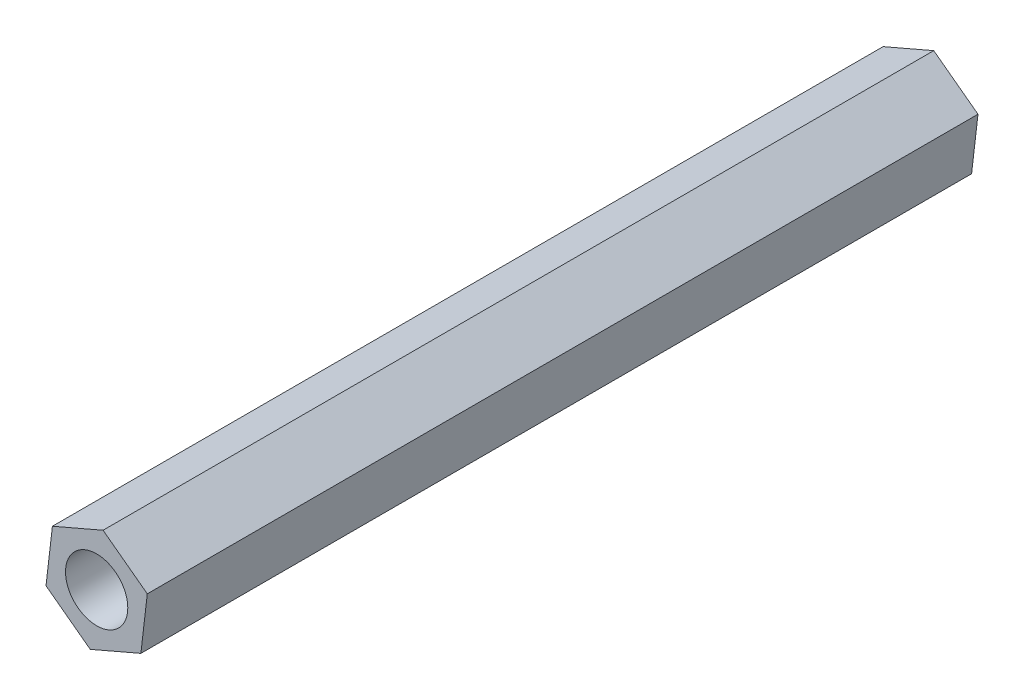
ISO-10303-21;
HEADER;
FILE_DESCRIPTION(('STEP AP214'),'2;1');
FILE_NAME('part.step','',(''),(''),'','','');
FILE_SCHEMA(('AUTOMOTIVE_DESIGN { 1 0 10303 214 1 1 1 1 }'));
ENDSEC;
DATA;
#1=APPLICATION_CONTEXT('core data for automotive mechanical design processes');
#2=APPLICATION_PROTOCOL_DEFINITION('international standard','automotive_design',2000,#1);
#3=PRODUCT_CONTEXT('',#1,'mechanical');
#4=PRODUCT('Part','Part','',(#3));
#5=PRODUCT_RELATED_PRODUCT_CATEGORY('part','',(#4));
#6=PRODUCT_DEFINITION_FORMATION('','',#4);
#7=PRODUCT_DEFINITION_CONTEXT('part definition',#1,'design');
#8=PRODUCT_DEFINITION('design','',#6,#7);
#9=PRODUCT_DEFINITION_SHAPE('','',#8);
#10=(LENGTH_UNIT() NAMED_UNIT(*) SI_UNIT(.MILLI.,.METRE.));
#11=(NAMED_UNIT(*) PLANE_ANGLE_UNIT() SI_UNIT($,.RADIAN.));
#12=(NAMED_UNIT(*) SI_UNIT($,.STERADIAN.) SOLID_ANGLE_UNIT());
#13=UNCERTAINTY_MEASURE_WITH_UNIT(LENGTH_MEASURE(1.E-05),#10,'distance_accuracy_value','');
#14=(GEOMETRIC_REPRESENTATION_CONTEXT(3) GLOBAL_UNCERTAINTY_ASSIGNED_CONTEXT((#13)) GLOBAL_UNIT_ASSIGNED_CONTEXT((#10,
#11,#12)) REPRESENTATION_CONTEXT('',''));
#15=CARTESIAN_POINT('',(0.,0.,0.));
#16=DIRECTION('',(0.,0.,1.));
#17=DIRECTION('',(1.,0.,0.));
#18=AXIS2_PLACEMENT_3D('',#15,#16,#17);
#19=CARTESIAN_POINT('',(-0.308527968496456,-2.63782937772495,40.));
#20=DIRECTION('',(-0.396007673742178,0.918247201105078,0.));
#21=DIRECTION('',(-0.918247201105078,-0.396007673742178,0.));
#22=AXIS2_PLACEMENT_3D('',#19,#20,#21);
#23=PLANE('',#22);
#24=DIRECTION('',(0.918247201105078,0.396007673742178,0.));
#25=VECTOR('',#24,1.);
#26=CARTESIAN_POINT('',(-0.308527968496456,-2.63782937772495,0.));
#27=LINE('',#26,#25);
#28=CARTESIAN_POINT('',(-0.308527968496456,-2.63782937772495,0.));
#29=VERTEX_POINT('',#28);
#30=CARTESIAN_POINT('',(2.13016326771047,-1.58610774735841,0.));
#31=VERTEX_POINT('',#30);
#32=EDGE_CURVE('E118',#29,#31,#27,.T.);
#33=ORIENTED_EDGE('',*,*,#32,.T.);
#34=DIRECTION('',(0.,0.,-1.));
#35=VECTOR('',#34,1.);
#36=CARTESIAN_POINT('',(2.13016326771047,-1.58610774735841,40.));
#37=LINE('',#36,#35);
#38=CARTESIAN_POINT('',(2.13016326771047,-1.58610774735841,40.));
#39=VERTEX_POINT('',#38);
#40=EDGE_CURVE('E11',#39,#31,#37,.T.);
#41=ORIENTED_EDGE('',*,*,#40,.F.);
#42=DIRECTION('',(0.918247201105078,0.396007673742178,0.));
#43=VECTOR('',#42,1.);
#44=CARTESIAN_POINT('',(-0.308527968496456,-2.63782937772495,40.));
#45=LINE('',#44,#43);
#46=CARTESIAN_POINT('',(-0.308527968496456,-2.63782937772495,40.));
#47=VERTEX_POINT('',#46);
#48=EDGE_CURVE('E129',#47,#39,#45,.T.);
#49=ORIENTED_EDGE('',*,*,#48,.F.);
#50=DIRECTION('',(0.,0.,-1.));
#51=VECTOR('',#50,1.);
#52=CARTESIAN_POINT('',(-0.308527968496456,-2.63782937772495,40.));
#53=LINE('',#52,#51);
#54=EDGE_CURVE('E114',#47,#29,#53,.T.);
#55=ORIENTED_EDGE('',*,*,#54,.T.);
#56=EDGE_LOOP('',(#33,#41,#49,#55));
#57=FACE_BOUND('',#56,.T.);
#58=ADVANCED_FACE('F34',(#57),#23,.F.);
#59=CARTESIAN_POINT('',(2.13016326771047,-1.58610774735841,40.));
#60=DIRECTION('',(-0.993229239982044,0.116170894998233,0.));
#61=DIRECTION('',(-0.116170894998233,-0.993229239982044,0.));
#62=AXIS2_PLACEMENT_3D('',#59,#60,#61);
#63=PLANE('',#62);
#64=DIRECTION('',(0.116170894998233,0.993229239982044,0.));
#65=VECTOR('',#64,1.);
#66=CARTESIAN_POINT('',(2.13016326771047,-1.58610774735841,0.));
#67=LINE('',#66,#65);
#68=CARTESIAN_POINT('',(2.43869123620693,1.05172163036654,0.));
#69=VERTEX_POINT('',#68);
#70=EDGE_CURVE('E121',#31,#69,#67,.T.);
#71=ORIENTED_EDGE('',*,*,#70,.T.);
#72=DIRECTION('',(0.,0.,-1.));
#73=VECTOR('',#72,1.);
#74=CARTESIAN_POINT('',(2.43869123620693,1.05172163036654,40.));
#75=LINE('',#74,#73);
#76=CARTESIAN_POINT('',(2.43869123620693,1.05172163036654,40.));
#77=VERTEX_POINT('',#76);
#78=EDGE_CURVE('E42',#77,#69,#75,.T.);
#79=ORIENTED_EDGE('',*,*,#78,.F.);
#80=DIRECTION('',(0.116170894998233,0.993229239982044,0.));
#81=VECTOR('',#80,1.);
#82=CARTESIAN_POINT('',(2.13016326771047,-1.58610774735841,40.));
#83=LINE('',#82,#81);
#84=EDGE_CURVE('E87',#39,#77,#83,.T.);
#85=ORIENTED_EDGE('',*,*,#84,.F.);
#86=ORIENTED_EDGE('',*,*,#40,.T.);
#87=EDGE_LOOP('',(#71,#79,#85,#86));
#88=FACE_BOUND('',#87,.T.);
#89=ADVANCED_FACE('F154',(#88),#63,.F.);
#90=CARTESIAN_POINT('',(2.43869123620693,1.05172163036654,40.));
#91=DIRECTION('',(-0.597221566239867,-0.802076306106845,0.));
#92=DIRECTION('',(0.802076306106845,-0.597221566239867,0.));
#93=AXIS2_PLACEMENT_3D('',#90,#91,#92);
#94=PLANE('',#93);
#95=DIRECTION('',(-0.802076306106845,0.597221566239867,0.));
#96=VECTOR('',#95,1.);
#97=CARTESIAN_POINT('',(2.43869123620693,1.05172163036654,0.));
#98=LINE('',#97,#96);
#99=CARTESIAN_POINT('',(0.308527968496456,2.63782937772495,0.));
#100=VERTEX_POINT('',#99);
#101=EDGE_CURVE('E124',#69,#100,#98,.T.);
#102=ORIENTED_EDGE('',*,*,#101,.T.);
#103=DIRECTION('',(0.,0.,-1.));
#104=VECTOR('',#103,1.);
#105=CARTESIAN_POINT('',(0.308527968496456,2.63782937772495,40.));
#106=LINE('',#105,#104);
#107=CARTESIAN_POINT('',(0.308527968496456,2.63782937772495,40.));
#108=VERTEX_POINT('',#107);
#109=EDGE_CURVE('E109',#108,#100,#106,.T.);
#110=ORIENTED_EDGE('',*,*,#109,.F.);
#111=DIRECTION('',(-0.802076306106845,0.597221566239867,0.));
#112=VECTOR('',#111,1.);
#113=CARTESIAN_POINT('',(2.43869123620693,1.05172163036654,40.));
#114=LINE('',#113,#112);
#115=EDGE_CURVE('E100',#77,#108,#114,.T.);
#116=ORIENTED_EDGE('',*,*,#115,.F.);
#117=ORIENTED_EDGE('',*,*,#78,.T.);
#118=EDGE_LOOP('',(#102,#110,#116,#117));
#119=FACE_BOUND('',#118,.T.);
#120=ADVANCED_FACE('F135',(#119),#94,.F.);
#121=CARTESIAN_POINT('',(0.308527968496456,2.63782937772495,40.));
#122=DIRECTION('',(0.396007673742178,-0.918247201105078,0.));
#123=DIRECTION('',(0.918247201105078,0.396007673742178,0.));
#124=AXIS2_PLACEMENT_3D('',#121,#122,#123);
#125=PLANE('',#124);
#126=DIRECTION('',(-0.918247201105078,-0.396007673742178,0.));
#127=VECTOR('',#126,1.);
#128=CARTESIAN_POINT('',(0.308527968496456,2.63782937772495,0.));
#129=LINE('',#128,#127);
#130=CARTESIAN_POINT('',(-2.13016326771047,1.58610774735841,0.));
#131=VERTEX_POINT('',#130);
#132=EDGE_CURVE('E108',#100,#131,#129,.T.);
#133=ORIENTED_EDGE('',*,*,#132,.T.);
#134=DIRECTION('',(0.,0.,-1.));
#135=VECTOR('',#134,1.);
#136=CARTESIAN_POINT('',(-2.13016326771047,1.58610774735841,40.));
#137=LINE('',#136,#135);
#138=CARTESIAN_POINT('',(-2.13016326771047,1.58610774735841,40.));
#139=VERTEX_POINT('',#138);
#140=EDGE_CURVE('E105',#139,#131,#137,.T.);
#141=ORIENTED_EDGE('',*,*,#140,.F.);
#142=DIRECTION('',(-0.918247201105078,-0.396007673742178,0.));
#143=VECTOR('',#142,1.);
#144=CARTESIAN_POINT('',(0.308527968496456,2.63782937772495,40.));
#145=LINE('',#144,#143);
#146=EDGE_CURVE('E94',#108,#139,#145,.T.);
#147=ORIENTED_EDGE('',*,*,#146,.F.);
#148=ORIENTED_EDGE('',*,*,#109,.T.);
#149=EDGE_LOOP('',(#133,#141,#147,#148));
#150=FACE_BOUND('',#149,.T.);
#151=ADVANCED_FACE('F106',(#150),#125,.F.);
#152=CARTESIAN_POINT('',(-2.13016326771047,1.58610774735841,40.));
#153=DIRECTION('',(0.993229239982044,-0.116170894998233,0.));
#154=DIRECTION('',(0.116170894998233,0.993229239982044,0.));
#155=AXIS2_PLACEMENT_3D('',#152,#153,#154);
#156=PLANE('',#155);
#157=DIRECTION('',(-0.116170894998233,-0.993229239982044,0.));
#158=VECTOR('',#157,1.);
#159=CARTESIAN_POINT('',(-2.13016326771047,1.58610774735841,0.));
#160=LINE('',#159,#158);
#161=CARTESIAN_POINT('',(-2.43869123620693,-1.05172163036654,0.));
#162=VERTEX_POINT('',#161);
#163=EDGE_CURVE('E73',#131,#162,#160,.T.);
#164=ORIENTED_EDGE('',*,*,#163,.T.);
#165=DIRECTION('',(0.,0.,-1.));
#166=VECTOR('',#165,1.);
#167=CARTESIAN_POINT('',(-2.43869123620693,-1.05172163036654,40.));
#168=LINE('',#167,#166);
#169=CARTESIAN_POINT('',(-2.43869123620693,-1.05172163036654,40.));
#170=VERTEX_POINT('',#169);
#171=EDGE_CURVE('E110',#170,#162,#168,.T.);
#172=ORIENTED_EDGE('',*,*,#171,.F.);
#173=DIRECTION('',(-0.116170894998233,-0.993229239982044,0.));
#174=VECTOR('',#173,1.);
#175=CARTESIAN_POINT('',(-2.13016326771047,1.58610774735841,40.));
#176=LINE('',#175,#174);
#177=EDGE_CURVE('E98',#139,#170,#176,.T.);
#178=ORIENTED_EDGE('',*,*,#177,.F.);
#179=ORIENTED_EDGE('',*,*,#140,.T.);
#180=EDGE_LOOP('',(#164,#172,#178,#179));
#181=FACE_BOUND('',#180,.T.);
#182=ADVANCED_FACE('F112',(#181),#156,.F.);
#183=CARTESIAN_POINT('',(-2.43869123620693,-1.05172163036654,40.));
#184=DIRECTION('',(0.597221566239866,0.802076306106845,0.));
#185=DIRECTION('',(-0.802076306106845,0.597221566239866,0.));
#186=AXIS2_PLACEMENT_3D('',#183,#184,#185);
#187=PLANE('',#186);
#188=DIRECTION('',(0.802076306106845,-0.597221566239866,0.));
#189=VECTOR('',#188,1.);
#190=CARTESIAN_POINT('',(-2.43869123620693,-1.05172163036654,0.));
#191=LINE('',#190,#189);
#192=EDGE_CURVE('E79',#162,#29,#191,.T.);
#193=ORIENTED_EDGE('',*,*,#192,.T.);
#194=ORIENTED_EDGE('',*,*,#54,.F.);
#195=DIRECTION('',(0.802076306106845,-0.597221566239866,0.));
#196=VECTOR('',#195,1.);
#197=CARTESIAN_POINT('',(-2.43869123620693,-1.05172163036654,40.));
#198=LINE('',#197,#196);
#199=EDGE_CURVE('E50',#170,#47,#198,.T.);
#200=ORIENTED_EDGE('',*,*,#199,.F.);
#201=ORIENTED_EDGE('',*,*,#171,.T.);
#202=EDGE_LOOP('',(#193,#194,#200,#201));
#203=FACE_BOUND('',#202,.T.);
#204=ADVANCED_FACE('F142',(#203),#187,.F.);
#205=CARTESIAN_POINT('',(0.,0.,40.));
#206=DIRECTION('',(0.,0.,1.));
#207=DIRECTION('',(1.,0.,0.));
#208=AXIS2_PLACEMENT_3D('',#205,#206,#207);
#209=PLANE('',#208);
#210=CARTESIAN_POINT('',(0.,0.,40.));
#211=DIRECTION('',(0.,0.,1.));
#212=DIRECTION('',(1.,0.,0.));
#213=AXIS2_PLACEMENT_3D('',#210,#211,#212);
#214=CIRCLE('',#213,1.5);
#215=CARTESIAN_POINT('',(1.5,0.,40.));
#216=VERTEX_POINT('',#215);
#217=EDGE_CURVE('E209',#216,#216,#214,.T.);
#218=ORIENTED_EDGE('',*,*,#217,.F.);
#219=EDGE_LOOP('',(#218));
#220=FACE_BOUND('',#219,.T.);
#221=ORIENTED_EDGE('',*,*,#48,.T.);
#222=ORIENTED_EDGE('',*,*,#84,.T.);
#223=ORIENTED_EDGE('',*,*,#115,.T.);
#224=ORIENTED_EDGE('',*,*,#146,.T.);
#225=ORIENTED_EDGE('',*,*,#177,.T.);
#226=ORIENTED_EDGE('',*,*,#199,.T.);
#227=EDGE_LOOP('',(#221,#222,#223,#224,#225,#226));
#228=FACE_BOUND('',#227,.T.);
#229=ADVANCED_FACE('F96',(#220,#228),#209,.T.);
#230=CARTESIAN_POINT('',(0.,0.,0.));
#231=DIRECTION('',(0.,0.,1.));
#232=DIRECTION('',(1.,0.,0.));
#233=AXIS2_PLACEMENT_3D('',#230,#231,#232);
#234=PLANE('',#233);
#235=CARTESIAN_POINT('',(0.,0.,0.));
#236=DIRECTION('',(0.,0.,1.));
#237=DIRECTION('',(1.,0.,0.));
#238=AXIS2_PLACEMENT_3D('',#235,#236,#237);
#239=CIRCLE('',#238,1.5);
#240=CARTESIAN_POINT('',(1.5,0.,0.));
#241=VERTEX_POINT('',#240);
#242=EDGE_CURVE('E122',#241,#241,#239,.T.);
#243=ORIENTED_EDGE('',*,*,#242,.T.);
#244=EDGE_LOOP('',(#243));
#245=FACE_BOUND('',#244,.T.);
#246=ORIENTED_EDGE('',*,*,#32,.F.);
#247=ORIENTED_EDGE('',*,*,#192,.F.);
#248=ORIENTED_EDGE('',*,*,#163,.F.);
#249=ORIENTED_EDGE('',*,*,#132,.F.);
#250=ORIENTED_EDGE('',*,*,#101,.F.);
#251=ORIENTED_EDGE('',*,*,#70,.F.);
#252=EDGE_LOOP('',(#246,#247,#248,#249,#250,#251));
#253=FACE_BOUND('',#252,.T.);
#254=ADVANCED_FACE('F138',(#245,#253),#234,.F.);
#255=CARTESIAN_POINT('',(0.,0.,0.));
#256=DIRECTION('',(0.,0.,1.));
#257=DIRECTION('',(1.,0.,0.));
#258=AXIS2_PLACEMENT_3D('',#255,#256,#257);
#259=CYLINDRICAL_SURFACE('',#258,1.5);
#260=ORIENTED_EDGE('',*,*,#242,.F.);
#261=EDGE_LOOP('',(#260));
#262=FACE_BOUND('',#261,.T.);
#263=ORIENTED_EDGE('',*,*,#217,.T.);
#264=EDGE_LOOP('',(#263));
#265=FACE_BOUND('',#264,.T.);
#266=ADVANCED_FACE('F191',(#262,#265),#259,.F.);
#267=CLOSED_SHELL('',(#58,#89,#120,#151,#182,#204,#229,#254,#266));
#268=MANIFOLD_SOLID_BREP('B2',#267);
#269=ADVANCED_BREP_SHAPE_REPRESENTATION('',(#18,#268),#14);
#270=SHAPE_DEFINITION_REPRESENTATION(#9,#269);
ENDSEC;
END-ISO-10303-21;
